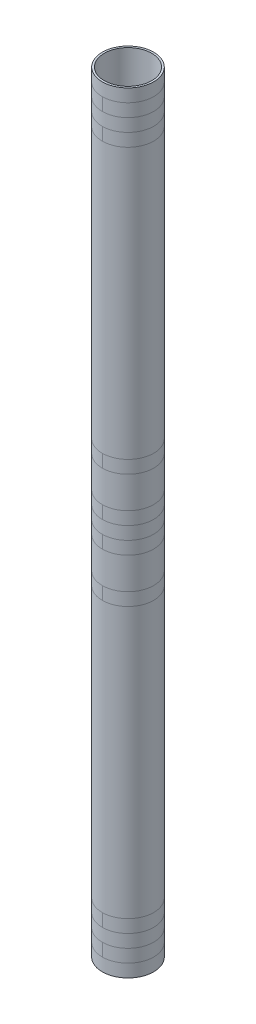
ISO-10303-21;
HEADER;
FILE_DESCRIPTION(('STEP AP214'),'2;1');
FILE_NAME('part.step','',(''),(''),'','','');
FILE_SCHEMA(('AUTOMOTIVE_DESIGN { 1 0 10303 214 1 1 1 1 }'));
ENDSEC;
DATA;
#1=APPLICATION_CONTEXT('core data for automotive mechanical design processes');
#2=APPLICATION_PROTOCOL_DEFINITION('international standard','automotive_design',2000,#1);
#3=PRODUCT_CONTEXT('',#1,'mechanical');
#4=PRODUCT('Part','Part','',(#3));
#5=PRODUCT_RELATED_PRODUCT_CATEGORY('part','',(#4));
#6=PRODUCT_DEFINITION_FORMATION('','',#4);
#7=PRODUCT_DEFINITION_CONTEXT('part definition',#1,'design');
#8=PRODUCT_DEFINITION('design','',#6,#7);
#9=PRODUCT_DEFINITION_SHAPE('','',#8);
#10=(LENGTH_UNIT() NAMED_UNIT(*) SI_UNIT(.MILLI.,.METRE.));
#11=(NAMED_UNIT(*) PLANE_ANGLE_UNIT() SI_UNIT($,.RADIAN.));
#12=(NAMED_UNIT(*) SI_UNIT($,.STERADIAN.) SOLID_ANGLE_UNIT());
#13=UNCERTAINTY_MEASURE_WITH_UNIT(LENGTH_MEASURE(1.E-05),#10,'distance_accuracy_value','');
#14=(GEOMETRIC_REPRESENTATION_CONTEXT(3) GLOBAL_UNCERTAINTY_ASSIGNED_CONTEXT((#13)) GLOBAL_UNIT_ASSIGNED_CONTEXT((#10,
#11,#12)) REPRESENTATION_CONTEXT('',''));
#15=CARTESIAN_POINT('',(0.,0.,0.));
#16=DIRECTION('',(0.,0.,1.));
#17=DIRECTION('',(1.,0.,0.));
#18=AXIS2_PLACEMENT_3D('',#15,#16,#17);
#19=CARTESIAN_POINT('',(0.,600.,0.));
#20=DIRECTION('',(0.,-1.,0.));
#21=DIRECTION('',(0.,0.,-1.));
#22=AXIS2_PLACEMENT_3D('',#19,#20,#21);
#23=CYLINDRICAL_SURFACE('',#22,20.);
#24=DIRECTION('',(0.,-1.,0.));
#25=VECTOR('',#24,1.);
#26=CARTESIAN_POINT('',(0.,600.,-20.));
#27=LINE('',#26,#25);
#28=CARTESIAN_POINT('',(0.,260.42,-20.));
#29=VERTEX_POINT('',#28);
#30=CARTESIAN_POINT('',(0.,250.42,-20.));
#31=VERTEX_POINT('',#30);
#32=EDGE_CURVE('E11',#29,#31,#27,.T.);
#33=ORIENTED_EDGE('',*,*,#32,.F.);
#34=CARTESIAN_POINT('',(0.,260.42,0.));
#35=DIRECTION('',(0.,-1.,0.));
#36=DIRECTION('',(0.,0.,-1.));
#37=AXIS2_PLACEMENT_3D('',#34,#35,#36);
#38=CIRCLE('',#37,20.);
#39=CARTESIAN_POINT('',(20.,260.42,0.));
#40=VERTEX_POINT('',#39);
#41=EDGE_CURVE('E322',#29,#40,#38,.T.);
#42=ORIENTED_EDGE('',*,*,#41,.T.);
#43=CARTESIAN_POINT('',(0.,260.42,0.));
#44=DIRECTION('',(0.,-1.,0.));
#45=DIRECTION('',(0.,0.,-1.));
#46=AXIS2_PLACEMENT_3D('',#43,#44,#45);
#47=CIRCLE('',#46,20.);
#48=CARTESIAN_POINT('',(0.,260.42,20.));
#49=VERTEX_POINT('',#48);
#50=EDGE_CURVE('E326',#40,#49,#47,.T.);
#51=ORIENTED_EDGE('',*,*,#50,.T.);
#52=DIRECTION('',(0.,-1.,0.));
#53=VECTOR('',#52,1.);
#54=CARTESIAN_POINT('',(0.,600.,20.));
#55=LINE('',#54,#53);
#56=CARTESIAN_POINT('',(0.,250.42,20.));
#57=VERTEX_POINT('',#56);
#58=EDGE_CURVE('E327',#49,#57,#55,.T.);
#59=ORIENTED_EDGE('',*,*,#58,.T.);
#60=CARTESIAN_POINT('',(0.,250.42,0.));
#61=DIRECTION('',(0.,1.,0.));
#62=DIRECTION('',(0.,0.,1.));
#63=AXIS2_PLACEMENT_3D('',#60,#61,#62);
#64=CIRCLE('',#63,20.);
#65=CARTESIAN_POINT('',(20.,250.42,0.));
#66=VERTEX_POINT('',#65);
#67=EDGE_CURVE('E49',#57,#66,#64,.T.);
#68=ORIENTED_EDGE('',*,*,#67,.T.);
#69=CARTESIAN_POINT('',(0.,250.42,0.));
#70=DIRECTION('',(0.,1.,0.));
#71=DIRECTION('',(0.,0.,1.));
#72=AXIS2_PLACEMENT_3D('',#69,#70,#71);
#73=CIRCLE('',#72,20.);
#74=EDGE_CURVE('E335',#66,#31,#73,.T.);
#75=ORIENTED_EDGE('',*,*,#74,.T.);
#76=EDGE_LOOP('',(#33,#42,#51,#59,#68,#75));
#77=FACE_BOUND('',#76,.T.);
#78=ADVANCED_FACE('F40',(#77),#23,.T.);
#79=CARTESIAN_POINT('',(0.,40.,0.));
#80=DIRECTION('',(0.,-1.,0.));
#81=DIRECTION('',(0.,0.,-1.));
#82=AXIS2_PLACEMENT_3D('',#79,#80,#81);
#83=CIRCLE('',#82,20.);
#84=CARTESIAN_POINT('',(0.,40.,-20.));
#85=VERTEX_POINT('',#84);
#86=CARTESIAN_POINT('',(0.,40.,20.0000000000001));
#87=VERTEX_POINT('',#86);
#88=EDGE_CURVE('E249',#85,#87,#83,.T.);
#89=ORIENTED_EDGE('',*,*,#88,.F.);
#90=EDGE_CURVE('E254',#87,#85,#83,.T.);
#91=ORIENTED_EDGE('',*,*,#90,.F.);
#92=EDGE_LOOP('',(#89,#91));
#93=FACE_BOUND('',#92,.T.);
#94=ORIENTED_EDGE('',*,*,#67,.F.);
#95=CARTESIAN_POINT('',(-20.,250.42,0.));
#96=VERTEX_POINT('',#95);
#97=EDGE_CURVE('E330',#96,#57,#64,.T.);
#98=ORIENTED_EDGE('',*,*,#97,.F.);
#99=EDGE_CURVE('E333',#31,#96,#73,.T.);
#100=ORIENTED_EDGE('',*,*,#99,.F.);
#101=ORIENTED_EDGE('',*,*,#74,.F.);
#102=EDGE_LOOP('',(#94,#98,#100,#101));
#103=FACE_BOUND('',#102,.T.);
#104=ADVANCED_FACE('F367',(#93,#103),#23,.T.);
#105=CARTESIAN_POINT('',(0.,285.,0.));
#106=DIRECTION('',(0.,1.,0.));
#107=DIRECTION('',(0.,0.,1.));
#108=AXIS2_PLACEMENT_3D('',#105,#106,#107);
#109=CIRCLE('',#108,20.);
#110=CARTESIAN_POINT('',(0.,285.,20.));
#111=VERTEX_POINT('',#110);
#112=CARTESIAN_POINT('',(0.,285.,-20.));
#113=VERTEX_POINT('',#112);
#114=EDGE_CURVE('E265',#111,#113,#109,.T.);
#115=ORIENTED_EDGE('',*,*,#114,.F.);
#116=EDGE_CURVE('E266',#113,#111,#109,.T.);
#117=ORIENTED_EDGE('',*,*,#116,.F.);
#118=EDGE_LOOP('',(#115,#117));
#119=FACE_BOUND('',#118,.T.);
#120=ORIENTED_EDGE('',*,*,#50,.F.);
#121=ORIENTED_EDGE('',*,*,#41,.F.);
#122=CARTESIAN_POINT('',(-20.,260.42,0.));
#123=VERTEX_POINT('',#122);
#124=EDGE_CURVE('E319',#123,#29,#38,.T.);
#125=ORIENTED_EDGE('',*,*,#124,.F.);
#126=EDGE_CURVE('E323',#49,#123,#47,.T.);
#127=ORIENTED_EDGE('',*,*,#126,.F.);
#128=EDGE_LOOP('',(#120,#121,#125,#127));
#129=FACE_BOUND('',#128,.T.);
#130=ADVANCED_FACE('F364',(#119,#129),#23,.T.);
#131=DIRECTION('',(0.,-1.,0.));
#132=VECTOR('',#131,1.);
#133=CARTESIAN_POINT('',(0.,600.,-20.));
#134=LINE('',#133,#132);
#135=CARTESIAN_POINT('',(0.,349.58,-20.));
#136=VERTEX_POINT('',#135);
#137=CARTESIAN_POINT('',(0.,339.58,-20.));
#138=VERTEX_POINT('',#137);
#139=EDGE_CURVE('E316',#136,#138,#134,.T.);
#140=ORIENTED_EDGE('',*,*,#139,.F.);
#141=CARTESIAN_POINT('',(0.,349.58,0.));
#142=DIRECTION('',(0.,-1.,0.));
#143=DIRECTION('',(0.,0.,-1.));
#144=AXIS2_PLACEMENT_3D('',#141,#142,#143);
#145=CIRCLE('',#144,20.);
#146=CARTESIAN_POINT('',(20.,349.58,0.));
#147=VERTEX_POINT('',#146);
#148=EDGE_CURVE('E298',#136,#147,#145,.T.);
#149=ORIENTED_EDGE('',*,*,#148,.T.);
#150=CARTESIAN_POINT('',(0.,349.58,0.));
#151=DIRECTION('',(0.,-1.,0.));
#152=DIRECTION('',(0.,0.,-1.));
#153=AXIS2_PLACEMENT_3D('',#150,#151,#152);
#154=CIRCLE('',#153,20.);
#155=CARTESIAN_POINT('',(0.,349.58,20.));
#156=VERTEX_POINT('',#155);
#157=EDGE_CURVE('E302',#147,#156,#154,.T.);
#158=ORIENTED_EDGE('',*,*,#157,.T.);
#159=DIRECTION('',(0.,-1.,0.));
#160=VECTOR('',#159,1.);
#161=CARTESIAN_POINT('',(0.,600.,20.));
#162=LINE('',#161,#160);
#163=CARTESIAN_POINT('',(0.,339.58,20.));
#164=VERTEX_POINT('',#163);
#165=EDGE_CURVE('E303',#156,#164,#162,.T.);
#166=ORIENTED_EDGE('',*,*,#165,.T.);
#167=CARTESIAN_POINT('',(0.,339.58,0.));
#168=DIRECTION('',(0.,1.,0.));
#169=DIRECTION('',(0.,0.,1.));
#170=AXIS2_PLACEMENT_3D('',#167,#168,#169);
#171=CIRCLE('',#170,20.);
#172=CARTESIAN_POINT('',(20.,339.58,0.));
#173=VERTEX_POINT('',#172);
#174=EDGE_CURVE('E312',#164,#173,#171,.T.);
#175=ORIENTED_EDGE('',*,*,#174,.T.);
#176=CARTESIAN_POINT('',(0.,339.58,0.));
#177=DIRECTION('',(0.,1.,0.));
#178=DIRECTION('',(0.,0.,1.));
#179=AXIS2_PLACEMENT_3D('',#176,#177,#178);
#180=CIRCLE('',#179,20.);
#181=EDGE_CURVE('E315',#173,#138,#180,.T.);
#182=ORIENTED_EDGE('',*,*,#181,.T.);
#183=EDGE_LOOP('',(#140,#149,#158,#166,#175,#182));
#184=FACE_BOUND('',#183,.T.);
#185=ADVANCED_FACE('F374',(#184),#23,.T.);
#186=CARTESIAN_POINT('',(0.,315.,0.));
#187=DIRECTION('',(0.,-1.,0.));
#188=DIRECTION('',(0.,0.,-1.));
#189=AXIS2_PLACEMENT_3D('',#186,#187,#188);
#190=CIRCLE('',#189,20.);
#191=CARTESIAN_POINT('',(0.,315.,-20.));
#192=VERTEX_POINT('',#191);
#193=CARTESIAN_POINT('',(0.,315.,20.));
#194=VERTEX_POINT('',#193);
#195=EDGE_CURVE('E291',#192,#194,#190,.T.);
#196=ORIENTED_EDGE('',*,*,#195,.F.);
#197=EDGE_CURVE('E264',#194,#192,#190,.T.);
#198=ORIENTED_EDGE('',*,*,#197,.F.);
#199=EDGE_LOOP('',(#196,#198));
#200=FACE_BOUND('',#199,.T.);
#201=ORIENTED_EDGE('',*,*,#174,.F.);
#202=CARTESIAN_POINT('',(-20.,339.58,0.));
#203=VERTEX_POINT('',#202);
#204=EDGE_CURVE('E307',#203,#164,#171,.T.);
#205=ORIENTED_EDGE('',*,*,#204,.F.);
#206=EDGE_CURVE('E311',#138,#203,#180,.T.);
#207=ORIENTED_EDGE('',*,*,#206,.F.);
#208=ORIENTED_EDGE('',*,*,#181,.F.);
#209=EDGE_LOOP('',(#201,#205,#207,#208));
#210=FACE_BOUND('',#209,.T.);
#211=ADVANCED_FACE('F410',(#200,#210),#23,.T.);
#212=CARTESIAN_POINT('',(0.,560.,0.));
#213=DIRECTION('',(0.,1.,0.));
#214=DIRECTION('',(0.,0.,1.));
#215=AXIS2_PLACEMENT_3D('',#212,#213,#214);
#216=CIRCLE('',#215,20.);
#217=CARTESIAN_POINT('',(0.,560.,20.));
#218=VERTEX_POINT('',#217);
#219=CARTESIAN_POINT('',(0.,560.,-20.));
#220=VERTEX_POINT('',#219);
#221=EDGE_CURVE('E231',#218,#220,#216,.T.);
#222=ORIENTED_EDGE('',*,*,#221,.F.);
#223=EDGE_CURVE('E232',#220,#218,#216,.T.);
#224=ORIENTED_EDGE('',*,*,#223,.F.);
#225=EDGE_LOOP('',(#222,#224));
#226=FACE_BOUND('',#225,.T.);
#227=ORIENTED_EDGE('',*,*,#157,.F.);
#228=ORIENTED_EDGE('',*,*,#148,.F.);
#229=CARTESIAN_POINT('',(-20.,349.58,0.));
#230=VERTEX_POINT('',#229);
#231=EDGE_CURVE('E281',#230,#136,#145,.T.);
#232=ORIENTED_EDGE('',*,*,#231,.F.);
#233=EDGE_CURVE('E299',#156,#230,#154,.T.);
#234=ORIENTED_EDGE('',*,*,#233,.F.);
#235=EDGE_LOOP('',(#227,#228,#232,#234));
#236=FACE_BOUND('',#235,.T.);
#237=ADVANCED_FACE('F469',(#226,#236),#23,.T.);
#238=DIRECTION('',(0.,-1.,0.));
#239=VECTOR('',#238,1.);
#240=CARTESIAN_POINT('',(0.,600.,19.9999999999999));
#241=LINE('',#240,#239);
#242=CARTESIAN_POINT('',(0.,305.,20.));
#243=VERTEX_POINT('',#242);
#244=EDGE_CURVE('E278',#194,#243,#241,.T.);
#245=ORIENTED_EDGE('',*,*,#244,.F.);
#246=ORIENTED_EDGE('',*,*,#197,.T.);
#247=DIRECTION('',(0.,-1.,0.));
#248=VECTOR('',#247,1.);
#249=CARTESIAN_POINT('',(0.,600.,-20.));
#250=LINE('',#249,#248);
#251=CARTESIAN_POINT('',(0.,305.,-20.));
#252=VERTEX_POINT('',#251);
#253=EDGE_CURVE('E287',#192,#252,#250,.T.);
#254=ORIENTED_EDGE('',*,*,#253,.T.);
#255=CARTESIAN_POINT('',(0.,305.,0.));
#256=DIRECTION('',(0.,1.,0.));
#257=DIRECTION('',(0.,0.,1.));
#258=AXIS2_PLACEMENT_3D('',#255,#256,#257);
#259=CIRCLE('',#258,20.);
#260=EDGE_CURVE('E283',#252,#243,#259,.T.);
#261=ORIENTED_EDGE('',*,*,#260,.T.);
#262=EDGE_LOOP('',(#245,#246,#254,#261));
#263=FACE_BOUND('',#262,.T.);
#264=ADVANCED_FACE('F413',(#263),#23,.T.);
#265=CARTESIAN_POINT('',(0.,295.,0.));
#266=DIRECTION('',(0.,-1.,0.));
#267=DIRECTION('',(0.,0.,-1.));
#268=AXIS2_PLACEMENT_3D('',#265,#266,#267);
#269=CIRCLE('',#268,20.);
#270=CARTESIAN_POINT('',(0.,295.,-20.));
#271=VERTEX_POINT('',#270);
#272=CARTESIAN_POINT('',(0.,295.,20.));
#273=VERTEX_POINT('',#272);
#274=EDGE_CURVE('E274',#271,#273,#269,.T.);
#275=ORIENTED_EDGE('',*,*,#274,.F.);
#276=EDGE_CURVE('E253',#273,#271,#269,.T.);
#277=ORIENTED_EDGE('',*,*,#276,.F.);
#278=EDGE_LOOP('',(#275,#277));
#279=FACE_BOUND('',#278,.T.);
#280=EDGE_CURVE('E282',#243,#252,#259,.T.);
#281=ORIENTED_EDGE('',*,*,#280,.F.);
#282=ORIENTED_EDGE('',*,*,#260,.F.);
#283=EDGE_LOOP('',(#281,#282));
#284=FACE_BOUND('',#283,.T.);
#285=ADVANCED_FACE('F416',(#279,#284),#23,.T.);
#286=ORIENTED_EDGE('',*,*,#231,.T.);
#287=ORIENTED_EDGE('',*,*,#139,.T.);
#288=ORIENTED_EDGE('',*,*,#206,.T.);
#289=ORIENTED_EDGE('',*,*,#204,.T.);
#290=ORIENTED_EDGE('',*,*,#165,.F.);
#291=ORIENTED_EDGE('',*,*,#233,.T.);
#292=EDGE_LOOP('',(#286,#287,#288,#289,#290,#291));
#293=FACE_BOUND('',#292,.T.);
#294=ADVANCED_FACE('F465',(#293),#23,.T.);
#295=DIRECTION('',(0.,-1.,0.));
#296=VECTOR('',#295,1.);
#297=CARTESIAN_POINT('',(0.,600.,19.9999999999999));
#298=LINE('',#297,#296);
#299=EDGE_CURVE('E261',#273,#111,#298,.T.);
#300=ORIENTED_EDGE('',*,*,#299,.F.);
#301=ORIENTED_EDGE('',*,*,#276,.T.);
#302=DIRECTION('',(0.,-1.,0.));
#303=VECTOR('',#302,1.);
#304=CARTESIAN_POINT('',(0.,600.,-20.));
#305=LINE('',#304,#303);
#306=EDGE_CURVE('E270',#271,#113,#305,.T.);
#307=ORIENTED_EDGE('',*,*,#306,.T.);
#308=ORIENTED_EDGE('',*,*,#116,.T.);
#309=EDGE_LOOP('',(#300,#301,#307,#308));
#310=FACE_BOUND('',#309,.T.);
#311=ADVANCED_FACE('F403',(#310),#23,.T.);
#312=ORIENTED_EDGE('',*,*,#124,.T.);
#313=ORIENTED_EDGE('',*,*,#32,.T.);
#314=ORIENTED_EDGE('',*,*,#99,.T.);
#315=ORIENTED_EDGE('',*,*,#97,.T.);
#316=ORIENTED_EDGE('',*,*,#58,.F.);
#317=ORIENTED_EDGE('',*,*,#126,.T.);
#318=EDGE_LOOP('',(#312,#313,#314,#315,#316,#317));
#319=FACE_BOUND('',#318,.T.);
#320=ADVANCED_FACE('F365',(#319),#23,.T.);
#321=ORIENTED_EDGE('',*,*,#195,.T.);
#322=ORIENTED_EDGE('',*,*,#244,.T.);
#323=ORIENTED_EDGE('',*,*,#280,.T.);
#324=ORIENTED_EDGE('',*,*,#253,.F.);
#325=EDGE_LOOP('',(#321,#322,#323,#324));
#326=FACE_BOUND('',#325,.T.);
#327=ADVANCED_FACE('F395',(#326),#23,.T.);
#328=DIRECTION('',(0.,-1.,0.));
#329=VECTOR('',#328,1.);
#330=CARTESIAN_POINT('',(0.,600.,-20.));
#331=LINE('',#330,#329);
#332=CARTESIAN_POINT('',(0.,30.,-20.));
#333=VERTEX_POINT('',#332);
#334=EDGE_CURVE('E250',#85,#333,#331,.T.);
#335=ORIENTED_EDGE('',*,*,#334,.F.);
#336=ORIENTED_EDGE('',*,*,#88,.T.);
#337=DIRECTION('',(0.,-1.,0.));
#338=VECTOR('',#337,1.);
#339=CARTESIAN_POINT('',(0.,600.,20.0000000000001));
#340=LINE('',#339,#338);
#341=CARTESIAN_POINT('',(0.,30.,20.0000000000001));
#342=VERTEX_POINT('',#341);
#343=EDGE_CURVE('E230',#87,#342,#340,.T.);
#344=ORIENTED_EDGE('',*,*,#343,.T.);
#345=CARTESIAN_POINT('',(0.,30.,0.));
#346=DIRECTION('',(0.,1.,0.));
#347=DIRECTION('',(0.,0.,1.));
#348=AXIS2_PLACEMENT_3D('',#345,#346,#347);
#349=CIRCLE('',#348,20.);
#350=EDGE_CURVE('E248',#342,#333,#349,.T.);
#351=ORIENTED_EDGE('',*,*,#350,.T.);
#352=EDGE_LOOP('',(#335,#336,#344,#351));
#353=FACE_BOUND('',#352,.T.);
#354=ADVANCED_FACE('F385',(#353),#23,.T.);
#355=CARTESIAN_POINT('',(0.,20.,0.));
#356=DIRECTION('',(0.,-1.,0.));
#357=DIRECTION('',(0.,0.,-1.));
#358=AXIS2_PLACEMENT_3D('',#355,#356,#357);
#359=CIRCLE('',#358,20.);
#360=CARTESIAN_POINT('',(0.,20.,-20.));
#361=VERTEX_POINT('',#360);
#362=CARTESIAN_POINT('',(0.,20.,20.));
#363=VERTEX_POINT('',#362);
#364=EDGE_CURVE('E190',#361,#363,#359,.T.);
#365=ORIENTED_EDGE('',*,*,#364,.F.);
#366=EDGE_CURVE('E180',#363,#361,#359,.T.);
#367=ORIENTED_EDGE('',*,*,#366,.F.);
#368=EDGE_LOOP('',(#365,#367));
#369=FACE_BOUND('',#368,.T.);
#370=ORIENTED_EDGE('',*,*,#350,.F.);
#371=EDGE_CURVE('E244',#333,#342,#349,.T.);
#372=ORIENTED_EDGE('',*,*,#371,.F.);
#373=EDGE_LOOP('',(#370,#372));
#374=FACE_BOUND('',#373,.T.);
#375=ADVANCED_FACE('F195',(#369,#374),#23,.T.);
#376=ORIENTED_EDGE('',*,*,#274,.T.);
#377=ORIENTED_EDGE('',*,*,#299,.T.);
#378=ORIENTED_EDGE('',*,*,#114,.T.);
#379=ORIENTED_EDGE('',*,*,#306,.F.);
#380=EDGE_LOOP('',(#376,#377,#378,#379));
#381=FACE_BOUND('',#380,.T.);
#382=ADVANCED_FACE('F388',(#381),#23,.T.);
#383=DIRECTION('',(0.,-1.,0.));
#384=VECTOR('',#383,1.);
#385=CARTESIAN_POINT('',(0.,600.,20.));
#386=LINE('',#385,#384);
#387=CARTESIAN_POINT('',(0.,570.,20.));
#388=VERTEX_POINT('',#387);
#389=EDGE_CURVE('E227',#388,#218,#386,.T.);
#390=ORIENTED_EDGE('',*,*,#389,.F.);
#391=CARTESIAN_POINT('',(0.,570.,0.));
#392=DIRECTION('',(0.,-1.,0.));
#393=DIRECTION('',(0.,0.,-1.));
#394=AXIS2_PLACEMENT_3D('',#391,#392,#393);
#395=CIRCLE('',#394,20.);
#396=CARTESIAN_POINT('',(0.,570.,-20.));
#397=VERTEX_POINT('',#396);
#398=EDGE_CURVE('E226',#388,#397,#395,.T.);
#399=ORIENTED_EDGE('',*,*,#398,.T.);
#400=DIRECTION('',(0.,-1.,0.));
#401=VECTOR('',#400,1.);
#402=CARTESIAN_POINT('',(0.,600.,-20.));
#403=LINE('',#402,#401);
#404=EDGE_CURVE('E236',#397,#220,#403,.T.);
#405=ORIENTED_EDGE('',*,*,#404,.T.);
#406=ORIENTED_EDGE('',*,*,#223,.T.);
#407=EDGE_LOOP('',(#390,#399,#405,#406));
#408=FACE_BOUND('',#407,.T.);
#409=ADVANCED_FACE('F393',(#408),#23,.T.);
#410=ORIENTED_EDGE('',*,*,#90,.T.);
#411=ORIENTED_EDGE('',*,*,#334,.T.);
#412=ORIENTED_EDGE('',*,*,#371,.T.);
#413=ORIENTED_EDGE('',*,*,#343,.F.);
#414=EDGE_LOOP('',(#410,#411,#412,#413));
#415=FACE_BOUND('',#414,.T.);
#416=ADVANCED_FACE('F382',(#415),#23,.T.);
#417=CARTESIAN_POINT('',(0.,580.,0.));
#418=DIRECTION('',(0.,1.,0.));
#419=DIRECTION('',(0.,0.,1.));
#420=AXIS2_PLACEMENT_3D('',#417,#418,#419);
#421=CIRCLE('',#420,20.);
#422=CARTESIAN_POINT('',(0.,580.,20.));
#423=VERTEX_POINT('',#422);
#424=CARTESIAN_POINT('',(0.,580.,-20.));
#425=VERTEX_POINT('',#424);
#426=EDGE_CURVE('E222',#423,#425,#421,.T.);
#427=ORIENTED_EDGE('',*,*,#426,.F.);
#428=EDGE_CURVE('E218',#425,#423,#421,.T.);
#429=ORIENTED_EDGE('',*,*,#428,.F.);
#430=EDGE_LOOP('',(#427,#429));
#431=FACE_BOUND('',#430,.T.);
#432=EDGE_CURVE('E240',#397,#388,#395,.T.);
#433=ORIENTED_EDGE('',*,*,#432,.F.);
#434=ORIENTED_EDGE('',*,*,#398,.F.);
#435=EDGE_LOOP('',(#433,#434));
#436=FACE_BOUND('',#435,.T.);
#437=ADVANCED_FACE('F486',(#431,#436),#23,.T.);
#438=DIRECTION('',(0.,-1.,0.));
#439=VECTOR('',#438,1.);
#440=CARTESIAN_POINT('',(0.,600.,20.));
#441=LINE('',#440,#439);
#442=CARTESIAN_POINT('',(0.,590.,20.));
#443=VERTEX_POINT('',#442);
#444=EDGE_CURVE('E223',#443,#423,#441,.T.);
#445=ORIENTED_EDGE('',*,*,#444,.F.);
#446=CARTESIAN_POINT('',(0.,590.,0.));
#447=DIRECTION('',(0.,-1.,0.));
#448=DIRECTION('',(0.,0.,-1.));
#449=AXIS2_PLACEMENT_3D('',#446,#447,#448);
#450=CIRCLE('',#449,20.);
#451=CARTESIAN_POINT('',(0.,590.,-20.));
#452=VERTEX_POINT('',#451);
#453=EDGE_CURVE('E186',#443,#452,#450,.T.);
#454=ORIENTED_EDGE('',*,*,#453,.T.);
#455=DIRECTION('',(0.,-1.,0.));
#456=VECTOR('',#455,1.);
#457=CARTESIAN_POINT('',(0.,600.,-20.));
#458=LINE('',#457,#456);
#459=EDGE_CURVE('E214',#452,#425,#458,.T.);
#460=ORIENTED_EDGE('',*,*,#459,.T.);
#461=ORIENTED_EDGE('',*,*,#428,.T.);
#462=EDGE_LOOP('',(#445,#454,#460,#461));
#463=FACE_BOUND('',#462,.T.);
#464=ADVANCED_FACE('F642',(#463),#23,.T.);
#465=ORIENTED_EDGE('',*,*,#432,.T.);
#466=ORIENTED_EDGE('',*,*,#389,.T.);
#467=ORIENTED_EDGE('',*,*,#221,.T.);
#468=ORIENTED_EDGE('',*,*,#404,.F.);
#469=EDGE_LOOP('',(#465,#466,#467,#468));
#470=FACE_BOUND('',#469,.T.);
#471=ADVANCED_FACE('F484',(#470),#23,.T.);
#472=CARTESIAN_POINT('',(0.,600.,0.));
#473=DIRECTION('',(0.,1.,0.));
#474=DIRECTION('',(0.,0.,1.));
#475=AXIS2_PLACEMENT_3D('',#472,#473,#474);
#476=CIRCLE('',#475,20.);
#477=CARTESIAN_POINT('',(0.,600.,20.));
#478=VERTEX_POINT('',#477);
#479=EDGE_CURVE('E198',#478,#478,#476,.T.);
#480=ORIENTED_EDGE('',*,*,#479,.F.);
#481=EDGE_LOOP('',(#480));
#482=FACE_BOUND('',#481,.T.);
#483=EDGE_CURVE('E213',#452,#443,#450,.T.);
#484=ORIENTED_EDGE('',*,*,#483,.F.);
#485=ORIENTED_EDGE('',*,*,#453,.F.);
#486=EDGE_LOOP('',(#484,#485));
#487=FACE_BOUND('',#486,.T.);
#488=ADVANCED_FACE('F625',(#482,#487),#23,.T.);
#489=DIRECTION('',(0.,-1.,0.));
#490=VECTOR('',#489,1.);
#491=CARTESIAN_POINT('',(0.,600.,20.0000000000001));
#492=LINE('',#491,#490);
#493=CARTESIAN_POINT('',(0.,10.,20.));
#494=VERTEX_POINT('',#493);
#495=EDGE_CURVE('E175',#363,#494,#492,.T.);
#496=ORIENTED_EDGE('',*,*,#495,.F.);
#497=ORIENTED_EDGE('',*,*,#366,.T.);
#498=DIRECTION('',(0.,-1.,0.));
#499=VECTOR('',#498,1.);
#500=CARTESIAN_POINT('',(0.,600.,-20.));
#501=LINE('',#500,#499);
#502=CARTESIAN_POINT('',(0.,10.,-20.));
#503=VERTEX_POINT('',#502);
#504=EDGE_CURVE('E191',#361,#503,#501,.T.);
#505=ORIENTED_EDGE('',*,*,#504,.T.);
#506=CARTESIAN_POINT('',(0.,10.,0.));
#507=DIRECTION('',(0.,1.,0.));
#508=DIRECTION('',(0.,0.,1.));
#509=AXIS2_PLACEMENT_3D('',#506,#507,#508);
#510=CIRCLE('',#509,20.);
#511=EDGE_CURVE('E182',#503,#494,#510,.T.);
#512=ORIENTED_EDGE('',*,*,#511,.T.);
#513=EDGE_LOOP('',(#496,#497,#505,#512));
#514=FACE_BOUND('',#513,.T.);
#515=ADVANCED_FACE('F177',(#514),#23,.T.);
#516=CARTESIAN_POINT('',(0.,0.,0.));
#517=DIRECTION('',(0.,1.,0.));
#518=DIRECTION('',(0.,0.,1.));
#519=AXIS2_PLACEMENT_3D('',#516,#517,#518);
#520=CIRCLE('',#519,20.);
#521=CARTESIAN_POINT('',(0.,0.,20.));
#522=VERTEX_POINT('',#521);
#523=EDGE_CURVE('E203',#522,#522,#520,.T.);
#524=ORIENTED_EDGE('',*,*,#523,.T.);
#525=EDGE_LOOP('',(#524));
#526=FACE_BOUND('',#525,.T.);
#527=EDGE_CURVE('E187',#494,#503,#510,.T.);
#528=ORIENTED_EDGE('',*,*,#527,.F.);
#529=ORIENTED_EDGE('',*,*,#511,.F.);
#530=EDGE_LOOP('',(#528,#529));
#531=FACE_BOUND('',#530,.T.);
#532=ADVANCED_FACE('F608',(#526,#531),#23,.T.);
#533=ORIENTED_EDGE('',*,*,#483,.T.);
#534=ORIENTED_EDGE('',*,*,#444,.T.);
#535=ORIENTED_EDGE('',*,*,#426,.T.);
#536=ORIENTED_EDGE('',*,*,#459,.F.);
#537=EDGE_LOOP('',(#533,#534,#535,#536));
#538=FACE_BOUND('',#537,.T.);
#539=ADVANCED_FACE('F599',(#538),#23,.T.);
#540=ORIENTED_EDGE('',*,*,#364,.T.);
#541=ORIENTED_EDGE('',*,*,#495,.T.);
#542=ORIENTED_EDGE('',*,*,#527,.T.);
#543=ORIENTED_EDGE('',*,*,#504,.F.);
#544=EDGE_LOOP('',(#540,#541,#542,#543));
#545=FACE_BOUND('',#544,.T.);
#546=ADVANCED_FACE('F42',(#545),#23,.T.);
#547=CARTESIAN_POINT('',(0.,600.,0.));
#548=DIRECTION('',(0.,1.,0.));
#549=DIRECTION('',(0.,0.,1.));
#550=AXIS2_PLACEMENT_3D('',#547,#548,#549);
#551=PLANE('',#550);
#552=CARTESIAN_POINT('',(0.,600.,0.));
#553=DIRECTION('',(0.,1.,0.));
#554=DIRECTION('',(0.,0.,1.));
#555=AXIS2_PLACEMENT_3D('',#552,#553,#554);
#556=CIRCLE('',#555,18.5);
#557=CARTESIAN_POINT('',(0.,600.,18.5));
#558=VERTEX_POINT('',#557);
#559=EDGE_CURVE('E743',#558,#558,#556,.T.);
#560=ORIENTED_EDGE('',*,*,#559,.F.);
#561=EDGE_LOOP('',(#560));
#562=FACE_BOUND('',#561,.T.);
#563=ORIENTED_EDGE('',*,*,#479,.T.);
#564=EDGE_LOOP('',(#563));
#565=FACE_BOUND('',#564,.T.);
#566=ADVANCED_FACE('F598',(#562,#565),#551,.T.);
#567=CARTESIAN_POINT('',(0.,0.,0.));
#568=DIRECTION('',(0.,1.,0.));
#569=DIRECTION('',(0.,0.,1.));
#570=AXIS2_PLACEMENT_3D('',#567,#568,#569);
#571=PLANE('',#570);
#572=CARTESIAN_POINT('',(0.,0.,0.));
#573=DIRECTION('',(0.,1.,0.));
#574=DIRECTION('',(0.,0.,1.));
#575=AXIS2_PLACEMENT_3D('',#572,#573,#574);
#576=CIRCLE('',#575,18.5);
#577=CARTESIAN_POINT('',(0.,0.,18.5));
#578=VERTEX_POINT('',#577);
#579=EDGE_CURVE('E774',#578,#578,#576,.T.);
#580=ORIENTED_EDGE('',*,*,#579,.T.);
#581=EDGE_LOOP('',(#580));
#582=FACE_BOUND('',#581,.T.);
#583=ORIENTED_EDGE('',*,*,#523,.F.);
#584=EDGE_LOOP('',(#583));
#585=FACE_BOUND('',#584,.T.);
#586=ADVANCED_FACE('F719',(#582,#585),#571,.F.);
#587=CARTESIAN_POINT('',(0.,0.,0.));
#588=DIRECTION('',(0.,1.,0.));
#589=DIRECTION('',(0.,0.,1.));
#590=AXIS2_PLACEMENT_3D('',#587,#588,#589);
#591=CYLINDRICAL_SURFACE('',#590,18.5);
#592=ORIENTED_EDGE('',*,*,#579,.F.);
#593=EDGE_LOOP('',(#592));
#594=FACE_BOUND('',#593,.T.);
#595=ORIENTED_EDGE('',*,*,#559,.T.);
#596=EDGE_LOOP('',(#595));
#597=FACE_BOUND('',#596,.T.);
#598=ADVANCED_FACE('F715',(#594,#597),#591,.F.);
#599=CLOSED_SHELL('',(#78,#104,#130,#185,#211,#237,#264,#285,#294,#311,#320,#327,#354,#375,#382,
#409,#416,#437,#464,#471,#488,#515,#532,#539,#546,#566,#586,#598));
#600=MANIFOLD_SOLID_BREP('B2',#599);
#601=ADVANCED_BREP_SHAPE_REPRESENTATION('',(#18,#600),#14);
#602=SHAPE_DEFINITION_REPRESENTATION(#9,#601);
ENDSEC;
END-ISO-10303-21;
